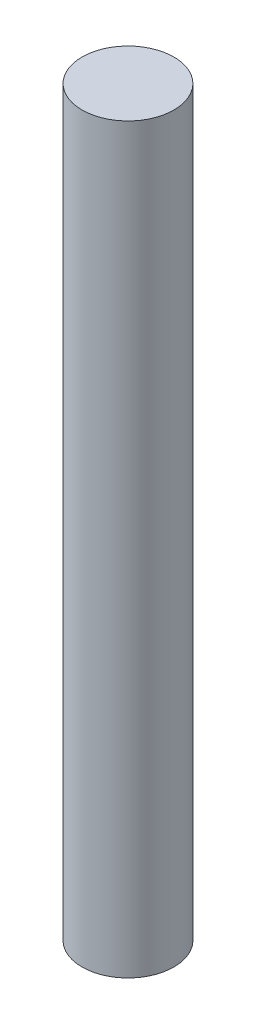
ISO-10303-21;
HEADER;
FILE_DESCRIPTION(('STEP AP214'),'2;1');
FILE_NAME('part.step','',(''),(''),'','','');
FILE_SCHEMA(('AUTOMOTIVE_DESIGN { 1 0 10303 214 1 1 1 1 }'));
ENDSEC;
DATA;
#1=APPLICATION_CONTEXT('core data for automotive mechanical design processes');
#2=APPLICATION_PROTOCOL_DEFINITION('international standard','automotive_design',2000,#1);
#3=PRODUCT_CONTEXT('',#1,'mechanical');
#4=PRODUCT('Part','Part','',(#3));
#5=PRODUCT_RELATED_PRODUCT_CATEGORY('part','',(#4));
#6=PRODUCT_DEFINITION_FORMATION('','',#4);
#7=PRODUCT_DEFINITION_CONTEXT('part definition',#1,'design');
#8=PRODUCT_DEFINITION('design','',#6,#7);
#9=PRODUCT_DEFINITION_SHAPE('','',#8);
#10=(LENGTH_UNIT() NAMED_UNIT(*) SI_UNIT(.MILLI.,.METRE.));
#11=(NAMED_UNIT(*) PLANE_ANGLE_UNIT() SI_UNIT($,.RADIAN.));
#12=(NAMED_UNIT(*) SI_UNIT($,.STERADIAN.) SOLID_ANGLE_UNIT());
#13=UNCERTAINTY_MEASURE_WITH_UNIT(LENGTH_MEASURE(1.E-05),#10,'distance_accuracy_value','');
#14=(GEOMETRIC_REPRESENTATION_CONTEXT(3) GLOBAL_UNCERTAINTY_ASSIGNED_CONTEXT((#13)) GLOBAL_UNIT_ASSIGNED_CONTEXT((#10,
#11,#12)) REPRESENTATION_CONTEXT('',''));
#15=CARTESIAN_POINT('',(0.,0.,0.));
#16=DIRECTION('',(0.,0.,1.));
#17=DIRECTION('',(1.,0.,0.));
#18=AXIS2_PLACEMENT_3D('',#15,#16,#17);
#19=CARTESIAN_POINT('',(0.,101.6,0.));
#20=DIRECTION('',(0.,-1.,0.));
#21=DIRECTION('',(0.,0.,-1.));
#22=AXIS2_PLACEMENT_3D('',#19,#20,#21);
#23=CYLINDRICAL_SURFACE('',#22,6.2865);
#24=CARTESIAN_POINT('',(0.,101.6,0.));
#25=DIRECTION('',(0.,1.,0.));
#26=DIRECTION('',(0.,0.,1.));
#27=AXIS2_PLACEMENT_3D('',#24,#25,#26);
#28=CIRCLE('',#27,6.2865);
#29=CARTESIAN_POINT('',(0.,101.6,6.2865));
#30=VERTEX_POINT('',#29);
#31=EDGE_CURVE('E10',#30,#30,#28,.T.);
#32=ORIENTED_EDGE('',*,*,#31,.F.);
#33=EDGE_LOOP('',(#32));
#34=FACE_BOUND('',#33,.T.);
#35=CARTESIAN_POINT('',(0.,0.,0.));
#36=DIRECTION('',(0.,1.,0.));
#37=DIRECTION('',(0.,0.,1.));
#38=AXIS2_PLACEMENT_3D('',#35,#36,#37);
#39=CIRCLE('',#38,6.2865);
#40=CARTESIAN_POINT('',(0.,0.,6.2865));
#41=VERTEX_POINT('',#40);
#42=EDGE_CURVE('E39',#41,#41,#39,.T.);
#43=ORIENTED_EDGE('',*,*,#42,.T.);
#44=EDGE_LOOP('',(#43));
#45=FACE_BOUND('',#44,.T.);
#46=ADVANCED_FACE('F36',(#34,#45),#23,.T.);
#47=CARTESIAN_POINT('',(0.,101.6,0.));
#48=DIRECTION('',(0.,1.,0.));
#49=DIRECTION('',(0.,0.,1.));
#50=AXIS2_PLACEMENT_3D('',#47,#48,#49);
#51=PLANE('',#50);
#52=ORIENTED_EDGE('',*,*,#31,.T.);
#53=EDGE_LOOP('',(#52));
#54=FACE_BOUND('',#53,.T.);
#55=ADVANCED_FACE('F53',(#54),#51,.T.);
#56=CARTESIAN_POINT('',(0.,0.,0.));
#57=DIRECTION('',(0.,1.,0.));
#58=DIRECTION('',(0.,0.,1.));
#59=AXIS2_PLACEMENT_3D('',#56,#57,#58);
#60=PLANE('',#59);
#61=ORIENTED_EDGE('',*,*,#42,.F.);
#62=EDGE_LOOP('',(#61));
#63=FACE_BOUND('',#62,.T.);
#64=ADVANCED_FACE('F51',(#63),#60,.F.);
#65=CLOSED_SHELL('',(#46,#55,#64));
#66=MANIFOLD_SOLID_BREP('B2',#65);
#67=ADVANCED_BREP_SHAPE_REPRESENTATION('',(#18,#66),#14);
#68=SHAPE_DEFINITION_REPRESENTATION(#9,#67);
ENDSEC;
END-ISO-10303-21;
